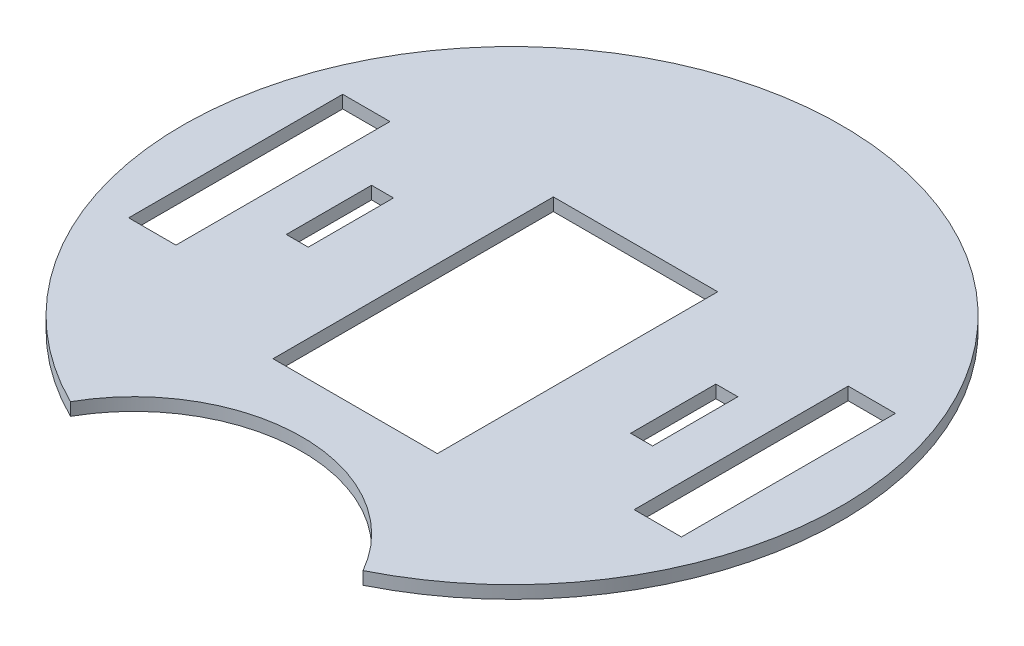
ISO-10303-21;
HEADER;
FILE_DESCRIPTION(('STEP AP214'),'2;1');
FILE_NAME('part.step','',(''),(''),'','','');
FILE_SCHEMA(('AUTOMOTIVE_DESIGN { 1 0 10303 214 1 1 1 1 }'));
ENDSEC;
DATA;
#1=APPLICATION_CONTEXT('core data for automotive mechanical design processes');
#2=APPLICATION_PROTOCOL_DEFINITION('international standard','automotive_design',2000,#1);
#3=PRODUCT_CONTEXT('',#1,'mechanical');
#4=PRODUCT('Part','Part','',(#3));
#5=PRODUCT_RELATED_PRODUCT_CATEGORY('part','',(#4));
#6=PRODUCT_DEFINITION_FORMATION('','',#4);
#7=PRODUCT_DEFINITION_CONTEXT('part definition',#1,'design');
#8=PRODUCT_DEFINITION('design','',#6,#7);
#9=PRODUCT_DEFINITION_SHAPE('','',#8);
#10=(LENGTH_UNIT() NAMED_UNIT(*) SI_UNIT(.MILLI.,.METRE.));
#11=(NAMED_UNIT(*) PLANE_ANGLE_UNIT() SI_UNIT($,.RADIAN.));
#12=(NAMED_UNIT(*) SI_UNIT($,.STERADIAN.) SOLID_ANGLE_UNIT());
#13=UNCERTAINTY_MEASURE_WITH_UNIT(LENGTH_MEASURE(1.E-05),#10,'distance_accuracy_value','');
#14=(GEOMETRIC_REPRESENTATION_CONTEXT(3) GLOBAL_UNCERTAINTY_ASSIGNED_CONTEXT((#13)) GLOBAL_UNIT_ASSIGNED_CONTEXT((#10,
#11,#12)) REPRESENTATION_CONTEXT('',''));
#15=CARTESIAN_POINT('',(0.,0.,0.));
#16=DIRECTION('',(0.,0.,1.));
#17=DIRECTION('',(1.,0.,0.));
#18=AXIS2_PLACEMENT_3D('',#15,#16,#17);
#19=CARTESIAN_POINT('',(0.,2.9,86.0416168146049));
#20=DIRECTION('',(0.,-1.,0.));
#21=DIRECTION('',(0.,0.,-1.));
#22=AXIS2_PLACEMENT_3D('',#19,#20,#21);
#23=CYLINDRICAL_SURFACE('',#22,38.25);
#24=CARTESIAN_POINT('',(0.,0.,86.0416168146049));
#25=DIRECTION('',(0.,-1.,0.));
#26=DIRECTION('',(0.,0.,1.));
#27=AXIS2_PLACEMENT_3D('',#24,#25,#26);
#28=CIRCLE('',#27,38.25);
#29=CARTESIAN_POINT('',(-33.2911053697012,0.,67.2064156406474));
#30=VERTEX_POINT('',#29);
#31=CARTESIAN_POINT('',(33.2911053697012,0.,67.2064156406474));
#32=VERTEX_POINT('',#31);
#33=EDGE_CURVE('E339',#30,#32,#28,.T.);
#34=ORIENTED_EDGE('',*,*,#33,.T.);
#35=DIRECTION('',(0.,-1.,0.));
#36=VECTOR('',#35,1.);
#37=CARTESIAN_POINT('',(33.2911053697012,2.9,67.2064156406474));
#38=LINE('',#37,#36);
#39=CARTESIAN_POINT('',(33.2911053697012,2.9,67.2064156406474));
#40=VERTEX_POINT('',#39);
#41=EDGE_CURVE('E11',#40,#32,#38,.T.);
#42=ORIENTED_EDGE('',*,*,#41,.F.);
#43=CARTESIAN_POINT('',(0.,2.9,86.0416168146049));
#44=DIRECTION('',(0.,-1.,0.));
#45=DIRECTION('',(0.,0.,1.));
#46=AXIS2_PLACEMENT_3D('',#43,#44,#45);
#47=CIRCLE('',#46,38.25);
#48=CARTESIAN_POINT('',(-33.2911053697012,2.9,67.2064156406474));
#49=VERTEX_POINT('',#48);
#50=EDGE_CURVE('E346',#49,#40,#47,.T.);
#51=ORIENTED_EDGE('',*,*,#50,.F.);
#52=DIRECTION('',(0.,-1.,0.));
#53=VECTOR('',#52,1.);
#54=CARTESIAN_POINT('',(-33.2911053697012,2.9,67.2064156406474));
#55=LINE('',#54,#53);
#56=EDGE_CURVE('E40',#49,#30,#55,.T.);
#57=ORIENTED_EDGE('',*,*,#56,.T.);
#58=EDGE_LOOP('',(#34,#42,#51,#57));
#59=FACE_BOUND('',#58,.T.);
#60=ADVANCED_FACE('F33',(#59),#23,.F.);
#61=CARTESIAN_POINT('',(0.,2.9,0.));
#62=DIRECTION('',(0.,-1.,0.));
#63=DIRECTION('',(0.,0.,-1.));
#64=AXIS2_PLACEMENT_3D('',#61,#62,#63);
#65=CYLINDRICAL_SURFACE('',#64,75.);
#66=CARTESIAN_POINT('',(0.,0.,0.));
#67=DIRECTION('',(0.,1.,0.));
#68=DIRECTION('',(0.,0.,1.));
#69=AXIS2_PLACEMENT_3D('',#66,#67,#68);
#70=CIRCLE('',#69,75.);
#71=EDGE_CURVE('E350',#32,#30,#70,.T.);
#72=ORIENTED_EDGE('',*,*,#71,.T.);
#73=ORIENTED_EDGE('',*,*,#56,.F.);
#74=CARTESIAN_POINT('',(0.,2.9,0.));
#75=DIRECTION('',(0.,1.,0.));
#76=DIRECTION('',(0.,0.,1.));
#77=AXIS2_PLACEMENT_3D('',#74,#75,#76);
#78=CIRCLE('',#77,75.);
#79=EDGE_CURVE('E349',#40,#49,#78,.T.);
#80=ORIENTED_EDGE('',*,*,#79,.F.);
#81=ORIENTED_EDGE('',*,*,#41,.T.);
#82=EDGE_LOOP('',(#72,#73,#80,#81));
#83=FACE_BOUND('',#82,.T.);
#84=ADVANCED_FACE('F362',(#83),#65,.T.);
#85=CARTESIAN_POINT('',(0.,2.9,43.0208084073025));
#86=DIRECTION('',(0.,1.,0.));
#87=DIRECTION('',(0.,0.,1.));
#88=AXIS2_PLACEMENT_3D('',#85,#86,#87);
#89=PLANE('',#88);
#90=DIRECTION('',(1.,0.,0.));
#91=VECTOR('',#90,1.);
#92=CARTESIAN_POINT('',(36.6798528025296,2.9,9.7));
#93=LINE('',#92,#91);
#94=CARTESIAN_POINT('',(36.6798528025296,2.9,9.7));
#95=VERTEX_POINT('',#94);
#96=CARTESIAN_POINT('',(41.6798528025296,2.9,9.7));
#97=VERTEX_POINT('',#96);
#98=EDGE_CURVE('E47',#95,#97,#93,.T.);
#99=ORIENTED_EDGE('',*,*,#98,.F.);
#100=DIRECTION('',(0.,0.,1.));
#101=VECTOR('',#100,1.);
#102=CARTESIAN_POINT('',(36.6798528025296,2.9,-9.7));
#103=LINE('',#102,#101);
#104=CARTESIAN_POINT('',(36.6798528025296,2.9,-9.7));
#105=VERTEX_POINT('',#104);
#106=EDGE_CURVE('E199',#105,#95,#103,.T.);
#107=ORIENTED_EDGE('',*,*,#106,.F.);
#108=DIRECTION('',(-1.,0.,0.));
#109=VECTOR('',#108,1.);
#110=CARTESIAN_POINT('',(41.6798528025296,2.9,-9.7));
#111=LINE('',#110,#109);
#112=CARTESIAN_POINT('',(41.6798528025296,2.9,-9.7));
#113=VERTEX_POINT('',#112);
#114=EDGE_CURVE('E202',#113,#105,#111,.T.);
#115=ORIENTED_EDGE('',*,*,#114,.F.);
#116=DIRECTION('',(0.,0.,-1.));
#117=VECTOR('',#116,1.);
#118=CARTESIAN_POINT('',(41.6798528025296,2.9,9.7));
#119=LINE('',#118,#117);
#120=EDGE_CURVE('E208',#97,#113,#119,.T.);
#121=ORIENTED_EDGE('',*,*,#120,.F.);
#122=EDGE_LOOP('',(#99,#107,#115,#121));
#123=FACE_BOUND('',#122,.T.);
#124=DIRECTION('',(0.,0.,1.));
#125=VECTOR('',#124,1.);
#126=CARTESIAN_POINT('',(-41.6798528025296,2.9,-9.7));
#127=LINE('',#126,#125);
#128=CARTESIAN_POINT('',(-41.6798528025296,2.9,-9.7));
#129=VERTEX_POINT('',#128);
#130=CARTESIAN_POINT('',(-41.6798528025296,2.9,9.7));
#131=VERTEX_POINT('',#130);
#132=EDGE_CURVE('E214',#129,#131,#127,.T.);
#133=ORIENTED_EDGE('',*,*,#132,.F.);
#134=DIRECTION('',(-1.,0.,0.));
#135=VECTOR('',#134,1.);
#136=CARTESIAN_POINT('',(-36.6798528025296,2.9,-9.7));
#137=LINE('',#136,#135);
#138=CARTESIAN_POINT('',(-36.6798528025296,2.9,-9.7));
#139=VERTEX_POINT('',#138);
#140=EDGE_CURVE('E222',#139,#129,#137,.T.);
#141=ORIENTED_EDGE('',*,*,#140,.F.);
#142=DIRECTION('',(0.,0.,-1.));
#143=VECTOR('',#142,1.);
#144=CARTESIAN_POINT('',(-36.6798528025296,2.9,9.7));
#145=LINE('',#144,#143);
#146=CARTESIAN_POINT('',(-36.6798528025296,2.9,9.7));
#147=VERTEX_POINT('',#146);
#148=EDGE_CURVE('E236',#147,#139,#145,.T.);
#149=ORIENTED_EDGE('',*,*,#148,.F.);
#150=DIRECTION('',(1.,0.,0.));
#151=VECTOR('',#150,1.);
#152=CARTESIAN_POINT('',(-41.6798528025296,2.9,9.7));
#153=LINE('',#152,#151);
#154=EDGE_CURVE('E233',#131,#147,#153,.T.);
#155=ORIENTED_EDGE('',*,*,#154,.F.);
#156=EDGE_LOOP('',(#133,#141,#149,#155));
#157=FACE_BOUND('',#156,.T.);
#158=DIRECTION('',(0.,0.,1.));
#159=VECTOR('',#158,1.);
#160=CARTESIAN_POINT('',(52.1374919880577,2.9,24.3527837526134));
#161=LINE('',#160,#159);
#162=CARTESIAN_POINT('',(52.1374919880577,2.9,-24.3527837526135));
#163=VERTEX_POINT('',#162);
#164=CARTESIAN_POINT('',(52.1374919880577,2.9,24.3527837526134));
#165=VERTEX_POINT('',#164);
#166=EDGE_CURVE('E243',#163,#165,#161,.T.);
#167=ORIENTED_EDGE('',*,*,#166,.F.);
#168=DIRECTION('',(-1.,0.,0.));
#169=VECTOR('',#168,1.);
#170=CARTESIAN_POINT('',(62.8974919880577,2.9,-24.3527837526135));
#171=LINE('',#170,#169);
#172=CARTESIAN_POINT('',(62.8974919880577,2.9,-24.3527837526135));
#173=VERTEX_POINT('',#172);
#174=EDGE_CURVE('E254',#173,#163,#171,.T.);
#175=ORIENTED_EDGE('',*,*,#174,.F.);
#176=DIRECTION('',(0.,0.,-1.));
#177=VECTOR('',#176,1.);
#178=CARTESIAN_POINT('',(62.8974919880577,2.9,24.3527837526134));
#179=LINE('',#178,#177);
#180=CARTESIAN_POINT('',(62.8974919880577,2.9,24.3527837526134));
#181=VERTEX_POINT('',#180);
#182=EDGE_CURVE('E268',#181,#173,#179,.T.);
#183=ORIENTED_EDGE('',*,*,#182,.F.);
#184=DIRECTION('',(1.,0.,0.));
#185=VECTOR('',#184,1.);
#186=CARTESIAN_POINT('',(62.8974919880577,2.9,24.3527837526134));
#187=LINE('',#186,#185);
#188=EDGE_CURVE('E265',#165,#181,#187,.T.);
#189=ORIENTED_EDGE('',*,*,#188,.F.);
#190=EDGE_LOOP('',(#167,#175,#183,#189));
#191=FACE_BOUND('',#190,.T.);
#192=DIRECTION('',(0.,0.,1.));
#193=VECTOR('',#192,1.);
#194=CARTESIAN_POINT('',(-62.8974919880577,2.9,24.3527837526134));
#195=LINE('',#194,#193);
#196=CARTESIAN_POINT('',(-62.8974919880577,2.9,-24.3527837526135));
#197=VERTEX_POINT('',#196);
#198=CARTESIAN_POINT('',(-62.8974919880577,2.9,24.3527837526134));
#199=VERTEX_POINT('',#198);
#200=EDGE_CURVE('E275',#197,#199,#195,.T.);
#201=ORIENTED_EDGE('',*,*,#200,.F.);
#202=DIRECTION('',(-1.,0.,0.));
#203=VECTOR('',#202,1.);
#204=CARTESIAN_POINT('',(-62.8974919880577,2.9,-24.3527837526135));
#205=LINE('',#204,#203);
#206=CARTESIAN_POINT('',(-52.1374919880577,2.9,-24.3527837526135));
#207=VERTEX_POINT('',#206);
#208=EDGE_CURVE('E286',#207,#197,#205,.T.);
#209=ORIENTED_EDGE('',*,*,#208,.F.);
#210=DIRECTION('',(0.,0.,-1.));
#211=VECTOR('',#210,1.);
#212=CARTESIAN_POINT('',(-52.1374919880577,2.9,24.3527837526134));
#213=LINE('',#212,#211);
#214=CARTESIAN_POINT('',(-52.1374919880577,2.9,24.3527837526134));
#215=VERTEX_POINT('',#214);
#216=EDGE_CURVE('E300',#215,#207,#213,.T.);
#217=ORIENTED_EDGE('',*,*,#216,.F.);
#218=DIRECTION('',(1.,0.,0.));
#219=VECTOR('',#218,1.);
#220=CARTESIAN_POINT('',(-62.8974919880577,2.9,24.3527837526134));
#221=LINE('',#220,#219);
#222=EDGE_CURVE('E297',#199,#215,#221,.T.);
#223=ORIENTED_EDGE('',*,*,#222,.F.);
#224=EDGE_LOOP('',(#201,#209,#217,#223));
#225=FACE_BOUND('',#224,.T.);
#226=DIRECTION('',(0.,0.,1.));
#227=VECTOR('',#226,1.);
#228=CARTESIAN_POINT('',(-18.7,2.9,35.7));
#229=LINE('',#228,#227);
#230=CARTESIAN_POINT('',(-18.7,2.9,-28.1));
#231=VERTEX_POINT('',#230);
#232=CARTESIAN_POINT('',(-18.7,2.9,35.7));
#233=VERTEX_POINT('',#232);
#234=EDGE_CURVE('E307',#231,#233,#229,.T.);
#235=ORIENTED_EDGE('',*,*,#234,.F.);
#236=DIRECTION('',(-1.,0.,0.));
#237=VECTOR('',#236,1.);
#238=CARTESIAN_POINT('',(-18.7,2.9,-28.1));
#239=LINE('',#238,#237);
#240=CARTESIAN_POINT('',(18.7,2.9,-28.1));
#241=VERTEX_POINT('',#240);
#242=EDGE_CURVE('E318',#241,#231,#239,.T.);
#243=ORIENTED_EDGE('',*,*,#242,.F.);
#244=DIRECTION('',(0.,0.,-1.));
#245=VECTOR('',#244,1.);
#246=CARTESIAN_POINT('',(18.7,2.9,35.7));
#247=LINE('',#246,#245);
#248=CARTESIAN_POINT('',(18.7,2.9,35.7));
#249=VERTEX_POINT('',#248);
#250=EDGE_CURVE('E332',#249,#241,#247,.T.);
#251=ORIENTED_EDGE('',*,*,#250,.F.);
#252=DIRECTION('',(1.,0.,0.));
#253=VECTOR('',#252,1.);
#254=CARTESIAN_POINT('',(-18.7,2.9,35.7));
#255=LINE('',#254,#253);
#256=EDGE_CURVE('E329',#233,#249,#255,.T.);
#257=ORIENTED_EDGE('',*,*,#256,.F.);
#258=EDGE_LOOP('',(#235,#243,#251,#257));
#259=FACE_BOUND('',#258,.T.);
#260=ORIENTED_EDGE('',*,*,#50,.T.);
#261=ORIENTED_EDGE('',*,*,#79,.T.);
#262=EDGE_LOOP('',(#260,#261));
#263=FACE_BOUND('',#262,.T.);
#264=ADVANCED_FACE('F364',(#123,#157,#191,#225,#259,#263),#89,.T.);
#265=CARTESIAN_POINT('',(0.,0.,43.0208084073025));
#266=DIRECTION('',(0.,1.,0.));
#267=DIRECTION('',(0.,0.,1.));
#268=AXIS2_PLACEMENT_3D('',#265,#266,#267);
#269=PLANE('',#268);
#270=DIRECTION('',(0.,0.,1.));
#271=VECTOR('',#270,1.);
#272=CARTESIAN_POINT('',(36.6798528025296,0.,-9.7));
#273=LINE('',#272,#271);
#274=CARTESIAN_POINT('',(36.6798528025296,0.,-9.7));
#275=VERTEX_POINT('',#274);
#276=CARTESIAN_POINT('',(36.6798528025296,0.,9.7));
#277=VERTEX_POINT('',#276);
#278=EDGE_CURVE('E189',#275,#277,#273,.T.);
#279=ORIENTED_EDGE('',*,*,#278,.T.);
#280=DIRECTION('',(1.,0.,0.));
#281=VECTOR('',#280,1.);
#282=CARTESIAN_POINT('',(36.6798528025296,0.,9.7));
#283=LINE('',#282,#281);
#284=CARTESIAN_POINT('',(41.6798528025296,0.,9.7));
#285=VERTEX_POINT('',#284);
#286=EDGE_CURVE('E183',#277,#285,#283,.T.);
#287=ORIENTED_EDGE('',*,*,#286,.T.);
#288=DIRECTION('',(0.,0.,-1.));
#289=VECTOR('',#288,1.);
#290=CARTESIAN_POINT('',(41.6798528025296,0.,9.7));
#291=LINE('',#290,#289);
#292=CARTESIAN_POINT('',(41.6798528025296,0.,-9.69999999999999));
#293=VERTEX_POINT('',#292);
#294=EDGE_CURVE('E192',#285,#293,#291,.T.);
#295=ORIENTED_EDGE('',*,*,#294,.T.);
#296=DIRECTION('',(-1.,0.,0.));
#297=VECTOR('',#296,1.);
#298=CARTESIAN_POINT('',(41.6798528025296,0.,-9.7));
#299=LINE('',#298,#297);
#300=EDGE_CURVE('E55',#293,#275,#299,.T.);
#301=ORIENTED_EDGE('',*,*,#300,.T.);
#302=EDGE_LOOP('',(#279,#287,#295,#301));
#303=FACE_BOUND('',#302,.T.);
#304=DIRECTION('',(-1.,0.,0.));
#305=VECTOR('',#304,1.);
#306=CARTESIAN_POINT('',(-36.6798528025296,0.,-9.7));
#307=LINE('',#306,#305);
#308=CARTESIAN_POINT('',(-36.6798528025296,0.,-9.7));
#309=VERTEX_POINT('',#308);
#310=CARTESIAN_POINT('',(-41.6798528025296,0.,-9.7));
#311=VERTEX_POINT('',#310);
#312=EDGE_CURVE('E228',#309,#311,#307,.T.);
#313=ORIENTED_EDGE('',*,*,#312,.T.);
#314=DIRECTION('',(0.,0.,1.));
#315=VECTOR('',#314,1.);
#316=CARTESIAN_POINT('',(-41.6798528025296,0.,-9.7));
#317=LINE('',#316,#315);
#318=CARTESIAN_POINT('',(-41.6798528025296,0.,9.7));
#319=VERTEX_POINT('',#318);
#320=EDGE_CURVE('E218',#311,#319,#317,.T.);
#321=ORIENTED_EDGE('',*,*,#320,.T.);
#322=DIRECTION('',(1.,0.,0.));
#323=VECTOR('',#322,1.);
#324=CARTESIAN_POINT('',(-41.6798528025296,0.,9.7));
#325=LINE('',#324,#323);
#326=CARTESIAN_POINT('',(-36.6798528025296,0.,9.7));
#327=VERTEX_POINT('',#326);
#328=EDGE_CURVE('E221',#319,#327,#325,.T.);
#329=ORIENTED_EDGE('',*,*,#328,.T.);
#330=DIRECTION('',(0.,0.,-1.));
#331=VECTOR('',#330,1.);
#332=CARTESIAN_POINT('',(-36.6798528025296,0.,9.7));
#333=LINE('',#332,#331);
#334=EDGE_CURVE('E225',#327,#309,#333,.T.);
#335=ORIENTED_EDGE('',*,*,#334,.T.);
#336=EDGE_LOOP('',(#313,#321,#329,#335));
#337=FACE_BOUND('',#336,.T.);
#338=DIRECTION('',(-1.,0.,0.));
#339=VECTOR('',#338,1.);
#340=CARTESIAN_POINT('',(62.8974919880577,0.,-24.3527837526135));
#341=LINE('',#340,#339);
#342=CARTESIAN_POINT('',(62.8974919880577,0.,-24.3527837526135));
#343=VERTEX_POINT('',#342);
#344=CARTESIAN_POINT('',(52.1374919880577,0.,-24.3527837526135));
#345=VERTEX_POINT('',#344);
#346=EDGE_CURVE('E260',#343,#345,#341,.T.);
#347=ORIENTED_EDGE('',*,*,#346,.T.);
#348=DIRECTION('',(0.,0.,1.));
#349=VECTOR('',#348,1.);
#350=CARTESIAN_POINT('',(52.1374919880577,0.,24.3527837526134));
#351=LINE('',#350,#349);
#352=CARTESIAN_POINT('',(52.1374919880577,0.,24.3527837526134));
#353=VERTEX_POINT('',#352);
#354=EDGE_CURVE('E250',#345,#353,#351,.T.);
#355=ORIENTED_EDGE('',*,*,#354,.T.);
#356=DIRECTION('',(1.,0.,0.));
#357=VECTOR('',#356,1.);
#358=CARTESIAN_POINT('',(62.8974919880577,0.,24.3527837526134));
#359=LINE('',#358,#357);
#360=CARTESIAN_POINT('',(62.8974919880577,0.,24.3527837526134));
#361=VERTEX_POINT('',#360);
#362=EDGE_CURVE('E253',#353,#361,#359,.T.);
#363=ORIENTED_EDGE('',*,*,#362,.T.);
#364=DIRECTION('',(0.,0.,-1.));
#365=VECTOR('',#364,1.);
#366=CARTESIAN_POINT('',(62.8974919880577,0.,24.3527837526134));
#367=LINE('',#366,#365);
#368=EDGE_CURVE('E257',#361,#343,#367,.T.);
#369=ORIENTED_EDGE('',*,*,#368,.T.);
#370=EDGE_LOOP('',(#347,#355,#363,#369));
#371=FACE_BOUND('',#370,.T.);
#372=DIRECTION('',(-1.,0.,0.));
#373=VECTOR('',#372,1.);
#374=CARTESIAN_POINT('',(-62.8974919880577,0.,-24.3527837526135));
#375=LINE('',#374,#373);
#376=CARTESIAN_POINT('',(-52.1374919880577,0.,-24.3527837526135));
#377=VERTEX_POINT('',#376);
#378=CARTESIAN_POINT('',(-62.8974919880577,0.,-24.3527837526135));
#379=VERTEX_POINT('',#378);
#380=EDGE_CURVE('E292',#377,#379,#375,.T.);
#381=ORIENTED_EDGE('',*,*,#380,.T.);
#382=DIRECTION('',(0.,0.,1.));
#383=VECTOR('',#382,1.);
#384=CARTESIAN_POINT('',(-62.8974919880577,0.,24.3527837526134));
#385=LINE('',#384,#383);
#386=CARTESIAN_POINT('',(-62.8974919880577,0.,24.3527837526134));
#387=VERTEX_POINT('',#386);
#388=EDGE_CURVE('E282',#379,#387,#385,.T.);
#389=ORIENTED_EDGE('',*,*,#388,.T.);
#390=DIRECTION('',(1.,0.,0.));
#391=VECTOR('',#390,1.);
#392=CARTESIAN_POINT('',(-62.8974919880577,0.,24.3527837526134));
#393=LINE('',#392,#391);
#394=CARTESIAN_POINT('',(-52.1374919880577,0.,24.3527837526134));
#395=VERTEX_POINT('',#394);
#396=EDGE_CURVE('E285',#387,#395,#393,.T.);
#397=ORIENTED_EDGE('',*,*,#396,.T.);
#398=DIRECTION('',(0.,0.,-1.));
#399=VECTOR('',#398,1.);
#400=CARTESIAN_POINT('',(-52.1374919880577,0.,24.3527837526134));
#401=LINE('',#400,#399);
#402=EDGE_CURVE('E289',#395,#377,#401,.T.);
#403=ORIENTED_EDGE('',*,*,#402,.T.);
#404=EDGE_LOOP('',(#381,#389,#397,#403));
#405=FACE_BOUND('',#404,.T.);
#406=DIRECTION('',(-1.,0.,0.));
#407=VECTOR('',#406,1.);
#408=CARTESIAN_POINT('',(-18.7,0.,-28.1));
#409=LINE('',#408,#407);
#410=CARTESIAN_POINT('',(18.7,0.,-28.1));
#411=VERTEX_POINT('',#410);
#412=CARTESIAN_POINT('',(-18.7,0.,-28.1));
#413=VERTEX_POINT('',#412);
#414=EDGE_CURVE('E324',#411,#413,#409,.T.);
#415=ORIENTED_EDGE('',*,*,#414,.T.);
#416=DIRECTION('',(0.,0.,1.));
#417=VECTOR('',#416,1.);
#418=CARTESIAN_POINT('',(-18.7,0.,35.7));
#419=LINE('',#418,#417);
#420=CARTESIAN_POINT('',(-18.7,0.,35.7));
#421=VERTEX_POINT('',#420);
#422=EDGE_CURVE('E314',#413,#421,#419,.T.);
#423=ORIENTED_EDGE('',*,*,#422,.T.);
#424=DIRECTION('',(1.,0.,0.));
#425=VECTOR('',#424,1.);
#426=CARTESIAN_POINT('',(-18.7,0.,35.7));
#427=LINE('',#426,#425);
#428=CARTESIAN_POINT('',(18.7,0.,35.7));
#429=VERTEX_POINT('',#428);
#430=EDGE_CURVE('E317',#421,#429,#427,.T.);
#431=ORIENTED_EDGE('',*,*,#430,.T.);
#432=DIRECTION('',(0.,0.,-1.));
#433=VECTOR('',#432,1.);
#434=CARTESIAN_POINT('',(18.7,0.,35.7));
#435=LINE('',#434,#433);
#436=EDGE_CURVE('E321',#429,#411,#435,.T.);
#437=ORIENTED_EDGE('',*,*,#436,.T.);
#438=EDGE_LOOP('',(#415,#423,#431,#437));
#439=FACE_BOUND('',#438,.T.);
#440=ORIENTED_EDGE('',*,*,#33,.F.);
#441=ORIENTED_EDGE('',*,*,#71,.F.);
#442=EDGE_LOOP('',(#440,#441));
#443=FACE_BOUND('',#442,.T.);
#444=ADVANCED_FACE('F196',(#303,#337,#371,#405,#439,#443),#269,.F.);
#445=CARTESIAN_POINT('',(-18.7,0.,35.7));
#446=DIRECTION('',(-1.,0.,0.));
#447=DIRECTION('',(0.,0.,1.));
#448=AXIS2_PLACEMENT_3D('',#445,#446,#447);
#449=PLANE('',#448);
#450=ORIENTED_EDGE('',*,*,#234,.T.);
#451=DIRECTION('',(0.,1.,0.));
#452=VECTOR('',#451,1.);
#453=CARTESIAN_POINT('',(-18.7,0.,35.7));
#454=LINE('',#453,#452);
#455=EDGE_CURVE('E327',#421,#233,#454,.T.);
#456=ORIENTED_EDGE('',*,*,#455,.F.);
#457=ORIENTED_EDGE('',*,*,#422,.F.);
#458=DIRECTION('',(0.,1.,0.));
#459=VECTOR('',#458,1.);
#460=CARTESIAN_POINT('',(-18.7,0.,-28.1));
#461=LINE('',#460,#459);
#462=EDGE_CURVE('E337',#413,#231,#461,.T.);
#463=ORIENTED_EDGE('',*,*,#462,.T.);
#464=EDGE_LOOP('',(#450,#456,#457,#463));
#465=FACE_BOUND('',#464,.T.);
#466=ADVANCED_FACE('F372',(#465),#449,.F.);
#467=CARTESIAN_POINT('',(-18.7,0.,-28.1));
#468=DIRECTION('',(0.,0.,-1.));
#469=DIRECTION('',(-1.,0.,0.));
#470=AXIS2_PLACEMENT_3D('',#467,#468,#469);
#471=PLANE('',#470);
#472=ORIENTED_EDGE('',*,*,#242,.T.);
#473=ORIENTED_EDGE('',*,*,#462,.F.);
#474=ORIENTED_EDGE('',*,*,#414,.F.);
#475=DIRECTION('',(0.,1.,0.));
#476=VECTOR('',#475,1.);
#477=CARTESIAN_POINT('',(18.7,0.,-28.1));
#478=LINE('',#477,#476);
#479=EDGE_CURVE('E340',#411,#241,#478,.T.);
#480=ORIENTED_EDGE('',*,*,#479,.T.);
#481=EDGE_LOOP('',(#472,#473,#474,#480));
#482=FACE_BOUND('',#481,.T.);
#483=ADVANCED_FACE('F393',(#482),#471,.F.);
#484=CARTESIAN_POINT('',(18.7,0.,35.7));
#485=DIRECTION('',(1.,0.,0.));
#486=DIRECTION('',(0.,0.,-1.));
#487=AXIS2_PLACEMENT_3D('',#484,#485,#486);
#488=PLANE('',#487);
#489=ORIENTED_EDGE('',*,*,#250,.T.);
#490=ORIENTED_EDGE('',*,*,#479,.F.);
#491=ORIENTED_EDGE('',*,*,#436,.F.);
#492=DIRECTION('',(0.,1.,0.));
#493=VECTOR('',#492,1.);
#494=CARTESIAN_POINT('',(18.7,0.,35.7));
#495=LINE('',#494,#493);
#496=EDGE_CURVE('E342',#429,#249,#495,.T.);
#497=ORIENTED_EDGE('',*,*,#496,.T.);
#498=EDGE_LOOP('',(#489,#490,#491,#497));
#499=FACE_BOUND('',#498,.T.);
#500=ADVANCED_FACE('F403',(#499),#488,.F.);
#501=CARTESIAN_POINT('',(-18.7,0.,35.7));
#502=DIRECTION('',(0.,0.,1.));
#503=DIRECTION('',(1.,0.,0.));
#504=AXIS2_PLACEMENT_3D('',#501,#502,#503);
#505=PLANE('',#504);
#506=ORIENTED_EDGE('',*,*,#256,.T.);
#507=ORIENTED_EDGE('',*,*,#496,.F.);
#508=ORIENTED_EDGE('',*,*,#430,.F.);
#509=ORIENTED_EDGE('',*,*,#455,.T.);
#510=EDGE_LOOP('',(#506,#507,#508,#509));
#511=FACE_BOUND('',#510,.T.);
#512=ADVANCED_FACE('F413',(#511),#505,.F.);
#513=CARTESIAN_POINT('',(-62.8974919880577,0.,24.3527837526134));
#514=DIRECTION('',(-1.,0.,0.));
#515=DIRECTION('',(0.,0.,1.));
#516=AXIS2_PLACEMENT_3D('',#513,#514,#515);
#517=PLANE('',#516);
#518=ORIENTED_EDGE('',*,*,#200,.T.);
#519=DIRECTION('',(0.,1.,0.));
#520=VECTOR('',#519,1.);
#521=CARTESIAN_POINT('',(-62.8974919880577,0.,24.3527837526134));
#522=LINE('',#521,#520);
#523=EDGE_CURVE('E295',#387,#199,#522,.T.);
#524=ORIENTED_EDGE('',*,*,#523,.F.);
#525=ORIENTED_EDGE('',*,*,#388,.F.);
#526=DIRECTION('',(0.,1.,0.));
#527=VECTOR('',#526,1.);
#528=CARTESIAN_POINT('',(-62.8974919880577,0.,-24.3527837526135));
#529=LINE('',#528,#527);
#530=EDGE_CURVE('E305',#379,#197,#529,.T.);
#531=ORIENTED_EDGE('',*,*,#530,.T.);
#532=EDGE_LOOP('',(#518,#524,#525,#531));
#533=FACE_BOUND('',#532,.T.);
#534=ADVANCED_FACE('F423',(#533),#517,.F.);
#535=CARTESIAN_POINT('',(-62.8974919880577,0.,-24.3527837526135));
#536=DIRECTION('',(0.,0.,-1.));
#537=DIRECTION('',(-1.,0.,0.));
#538=AXIS2_PLACEMENT_3D('',#535,#536,#537);
#539=PLANE('',#538);
#540=ORIENTED_EDGE('',*,*,#208,.T.);
#541=ORIENTED_EDGE('',*,*,#530,.F.);
#542=ORIENTED_EDGE('',*,*,#380,.F.);
#543=DIRECTION('',(0.,1.,0.));
#544=VECTOR('',#543,1.);
#545=CARTESIAN_POINT('',(-52.1374919880577,0.,-24.3527837526135));
#546=LINE('',#545,#544);
#547=EDGE_CURVE('E308',#377,#207,#546,.T.);
#548=ORIENTED_EDGE('',*,*,#547,.T.);
#549=EDGE_LOOP('',(#540,#541,#542,#548));
#550=FACE_BOUND('',#549,.T.);
#551=ADVANCED_FACE('F433',(#550),#539,.F.);
#552=CARTESIAN_POINT('',(-52.1374919880577,0.,24.3527837526134));
#553=DIRECTION('',(1.,0.,0.));
#554=DIRECTION('',(0.,0.,-1.));
#555=AXIS2_PLACEMENT_3D('',#552,#553,#554);
#556=PLANE('',#555);
#557=ORIENTED_EDGE('',*,*,#216,.T.);
#558=ORIENTED_EDGE('',*,*,#547,.F.);
#559=ORIENTED_EDGE('',*,*,#402,.F.);
#560=DIRECTION('',(0.,1.,0.));
#561=VECTOR('',#560,1.);
#562=CARTESIAN_POINT('',(-52.1374919880577,0.,24.3527837526134));
#563=LINE('',#562,#561);
#564=EDGE_CURVE('E310',#395,#215,#563,.T.);
#565=ORIENTED_EDGE('',*,*,#564,.T.);
#566=EDGE_LOOP('',(#557,#558,#559,#565));
#567=FACE_BOUND('',#566,.T.);
#568=ADVANCED_FACE('F443',(#567),#556,.F.);
#569=CARTESIAN_POINT('',(-62.8974919880577,0.,24.3527837526134));
#570=DIRECTION('',(0.,0.,1.));
#571=DIRECTION('',(1.,0.,0.));
#572=AXIS2_PLACEMENT_3D('',#569,#570,#571);
#573=PLANE('',#572);
#574=ORIENTED_EDGE('',*,*,#222,.T.);
#575=ORIENTED_EDGE('',*,*,#564,.F.);
#576=ORIENTED_EDGE('',*,*,#396,.F.);
#577=ORIENTED_EDGE('',*,*,#523,.T.);
#578=EDGE_LOOP('',(#574,#575,#576,#577));
#579=FACE_BOUND('',#578,.T.);
#580=ADVANCED_FACE('F453',(#579),#573,.F.);
#581=CARTESIAN_POINT('',(52.1374919880577,0.,24.3527837526134));
#582=DIRECTION('',(-1.,0.,0.));
#583=DIRECTION('',(0.,0.,1.));
#584=AXIS2_PLACEMENT_3D('',#581,#582,#583);
#585=PLANE('',#584);
#586=ORIENTED_EDGE('',*,*,#166,.T.);
#587=DIRECTION('',(0.,1.,0.));
#588=VECTOR('',#587,1.);
#589=CARTESIAN_POINT('',(52.1374919880577,0.,24.3527837526134));
#590=LINE('',#589,#588);
#591=EDGE_CURVE('E263',#353,#165,#590,.T.);
#592=ORIENTED_EDGE('',*,*,#591,.F.);
#593=ORIENTED_EDGE('',*,*,#354,.F.);
#594=DIRECTION('',(0.,1.,0.));
#595=VECTOR('',#594,1.);
#596=CARTESIAN_POINT('',(52.1374919880577,0.,-24.3527837526135));
#597=LINE('',#596,#595);
#598=EDGE_CURVE('E273',#345,#163,#597,.T.);
#599=ORIENTED_EDGE('',*,*,#598,.T.);
#600=EDGE_LOOP('',(#586,#592,#593,#599));
#601=FACE_BOUND('',#600,.T.);
#602=ADVANCED_FACE('F463',(#601),#585,.F.);
#603=CARTESIAN_POINT('',(62.8974919880577,0.,-24.3527837526135));
#604=DIRECTION('',(0.,0.,-1.));
#605=DIRECTION('',(-1.,0.,0.));
#606=AXIS2_PLACEMENT_3D('',#603,#604,#605);
#607=PLANE('',#606);
#608=ORIENTED_EDGE('',*,*,#174,.T.);
#609=ORIENTED_EDGE('',*,*,#598,.F.);
#610=ORIENTED_EDGE('',*,*,#346,.F.);
#611=DIRECTION('',(0.,1.,0.));
#612=VECTOR('',#611,1.);
#613=CARTESIAN_POINT('',(62.8974919880577,0.,-24.3527837526135));
#614=LINE('',#613,#612);
#615=EDGE_CURVE('E276',#343,#173,#614,.T.);
#616=ORIENTED_EDGE('',*,*,#615,.T.);
#617=EDGE_LOOP('',(#608,#609,#610,#616));
#618=FACE_BOUND('',#617,.T.);
#619=ADVANCED_FACE('F473',(#618),#607,.F.);
#620=CARTESIAN_POINT('',(62.8974919880577,0.,24.3527837526134));
#621=DIRECTION('',(1.,0.,0.));
#622=DIRECTION('',(0.,0.,-1.));
#623=AXIS2_PLACEMENT_3D('',#620,#621,#622);
#624=PLANE('',#623);
#625=ORIENTED_EDGE('',*,*,#182,.T.);
#626=ORIENTED_EDGE('',*,*,#615,.F.);
#627=ORIENTED_EDGE('',*,*,#368,.F.);
#628=DIRECTION('',(0.,1.,0.));
#629=VECTOR('',#628,1.);
#630=CARTESIAN_POINT('',(62.8974919880577,0.,24.3527837526134));
#631=LINE('',#630,#629);
#632=EDGE_CURVE('E278',#361,#181,#631,.T.);
#633=ORIENTED_EDGE('',*,*,#632,.T.);
#634=EDGE_LOOP('',(#625,#626,#627,#633));
#635=FACE_BOUND('',#634,.T.);
#636=ADVANCED_FACE('F483',(#635),#624,.F.);
#637=CARTESIAN_POINT('',(62.8974919880577,0.,24.3527837526134));
#638=DIRECTION('',(0.,0.,1.));
#639=DIRECTION('',(1.,0.,0.));
#640=AXIS2_PLACEMENT_3D('',#637,#638,#639);
#641=PLANE('',#640);
#642=ORIENTED_EDGE('',*,*,#188,.T.);
#643=ORIENTED_EDGE('',*,*,#632,.F.);
#644=ORIENTED_EDGE('',*,*,#362,.F.);
#645=ORIENTED_EDGE('',*,*,#591,.T.);
#646=EDGE_LOOP('',(#642,#643,#644,#645));
#647=FACE_BOUND('',#646,.T.);
#648=ADVANCED_FACE('F493',(#647),#641,.F.);
#649=CARTESIAN_POINT('',(-41.6798528025296,0.,-9.7));
#650=DIRECTION('',(-1.,0.,0.));
#651=DIRECTION('',(0.,0.,1.));
#652=AXIS2_PLACEMENT_3D('',#649,#650,#651);
#653=PLANE('',#652);
#654=ORIENTED_EDGE('',*,*,#132,.T.);
#655=DIRECTION('',(0.,1.,0.));
#656=VECTOR('',#655,1.);
#657=CARTESIAN_POINT('',(-41.6798528025296,0.,9.7));
#658=LINE('',#657,#656);
#659=EDGE_CURVE('E231',#319,#131,#658,.T.);
#660=ORIENTED_EDGE('',*,*,#659,.F.);
#661=ORIENTED_EDGE('',*,*,#320,.F.);
#662=DIRECTION('',(0.,1.,0.));
#663=VECTOR('',#662,1.);
#664=CARTESIAN_POINT('',(-41.6798528025296,0.,-9.7));
#665=LINE('',#664,#663);
#666=EDGE_CURVE('E241',#311,#129,#665,.T.);
#667=ORIENTED_EDGE('',*,*,#666,.T.);
#668=EDGE_LOOP('',(#654,#660,#661,#667));
#669=FACE_BOUND('',#668,.T.);
#670=ADVANCED_FACE('F502',(#669),#653,.F.);
#671=CARTESIAN_POINT('',(-36.6798528025296,0.,-9.7));
#672=DIRECTION('',(0.,0.,-1.));
#673=DIRECTION('',(-1.,0.,0.));
#674=AXIS2_PLACEMENT_3D('',#671,#672,#673);
#675=PLANE('',#674);
#676=ORIENTED_EDGE('',*,*,#140,.T.);
#677=ORIENTED_EDGE('',*,*,#666,.F.);
#678=ORIENTED_EDGE('',*,*,#312,.F.);
#679=DIRECTION('',(0.,1.,0.));
#680=VECTOR('',#679,1.);
#681=CARTESIAN_POINT('',(-36.6798528025296,0.,-9.7));
#682=LINE('',#681,#680);
#683=EDGE_CURVE('E244',#309,#139,#682,.T.);
#684=ORIENTED_EDGE('',*,*,#683,.T.);
#685=EDGE_LOOP('',(#676,#677,#678,#684));
#686=FACE_BOUND('',#685,.T.);
#687=ADVANCED_FACE('F521',(#686),#675,.F.);
#688=CARTESIAN_POINT('',(-36.6798528025296,0.,9.7));
#689=DIRECTION('',(1.,0.,0.));
#690=DIRECTION('',(0.,0.,-1.));
#691=AXIS2_PLACEMENT_3D('',#688,#689,#690);
#692=PLANE('',#691);
#693=ORIENTED_EDGE('',*,*,#148,.T.);
#694=ORIENTED_EDGE('',*,*,#683,.F.);
#695=ORIENTED_EDGE('',*,*,#334,.F.);
#696=DIRECTION('',(0.,1.,0.));
#697=VECTOR('',#696,1.);
#698=CARTESIAN_POINT('',(-36.6798528025296,0.,9.7));
#699=LINE('',#698,#697);
#700=EDGE_CURVE('E246',#327,#147,#699,.T.);
#701=ORIENTED_EDGE('',*,*,#700,.T.);
#702=EDGE_LOOP('',(#693,#694,#695,#701));
#703=FACE_BOUND('',#702,.T.);
#704=ADVANCED_FACE('F531',(#703),#692,.F.);
#705=CARTESIAN_POINT('',(-41.6798528025296,0.,9.7));
#706=DIRECTION('',(0.,0.,1.));
#707=DIRECTION('',(1.,0.,0.));
#708=AXIS2_PLACEMENT_3D('',#705,#706,#707);
#709=PLANE('',#708);
#710=ORIENTED_EDGE('',*,*,#154,.T.);
#711=ORIENTED_EDGE('',*,*,#700,.F.);
#712=ORIENTED_EDGE('',*,*,#328,.F.);
#713=ORIENTED_EDGE('',*,*,#659,.T.);
#714=EDGE_LOOP('',(#710,#711,#712,#713));
#715=FACE_BOUND('',#714,.T.);
#716=ADVANCED_FACE('F541',(#715),#709,.F.);
#717=CARTESIAN_POINT('',(36.6798528025296,0.,9.7));
#718=DIRECTION('',(0.,0.,1.));
#719=DIRECTION('',(1.,0.,0.));
#720=AXIS2_PLACEMENT_3D('',#717,#718,#719);
#721=PLANE('',#720);
#722=ORIENTED_EDGE('',*,*,#98,.T.);
#723=DIRECTION('',(0.,1.,0.));
#724=VECTOR('',#723,1.);
#725=CARTESIAN_POINT('',(41.6798528025296,0.,9.7));
#726=LINE('',#725,#724);
#727=EDGE_CURVE('E179',#285,#97,#726,.T.);
#728=ORIENTED_EDGE('',*,*,#727,.F.);
#729=ORIENTED_EDGE('',*,*,#286,.F.);
#730=DIRECTION('',(0.,1.,0.));
#731=VECTOR('',#730,1.);
#732=CARTESIAN_POINT('',(36.6798528025296,0.,9.7));
#733=LINE('',#732,#731);
#734=EDGE_CURVE('E212',#277,#95,#733,.T.);
#735=ORIENTED_EDGE('',*,*,#734,.T.);
#736=EDGE_LOOP('',(#722,#728,#729,#735));
#737=FACE_BOUND('',#736,.T.);
#738=ADVANCED_FACE('F181',(#737),#721,.F.);
#739=CARTESIAN_POINT('',(36.6798528025296,0.,-9.7));
#740=DIRECTION('',(-1.,0.,0.));
#741=DIRECTION('',(0.,0.,1.));
#742=AXIS2_PLACEMENT_3D('',#739,#740,#741);
#743=PLANE('',#742);
#744=ORIENTED_EDGE('',*,*,#106,.T.);
#745=ORIENTED_EDGE('',*,*,#734,.F.);
#746=ORIENTED_EDGE('',*,*,#278,.F.);
#747=DIRECTION('',(0.,1.,0.));
#748=VECTOR('',#747,1.);
#749=CARTESIAN_POINT('',(36.6798528025296,0.,-9.7));
#750=LINE('',#749,#748);
#751=EDGE_CURVE('E215',#275,#105,#750,.T.);
#752=ORIENTED_EDGE('',*,*,#751,.T.);
#753=EDGE_LOOP('',(#744,#745,#746,#752));
#754=FACE_BOUND('',#753,.T.);
#755=ADVANCED_FACE('F560',(#754),#743,.F.);
#756=CARTESIAN_POINT('',(41.6798528025296,0.,-9.7));
#757=DIRECTION('',(0.,0.,-1.));
#758=DIRECTION('',(-1.,0.,0.));
#759=AXIS2_PLACEMENT_3D('',#756,#757,#758);
#760=PLANE('',#759);
#761=ORIENTED_EDGE('',*,*,#114,.T.);
#762=ORIENTED_EDGE('',*,*,#751,.F.);
#763=ORIENTED_EDGE('',*,*,#300,.F.);
#764=DIRECTION('',(0.,1.,0.));
#765=VECTOR('',#764,1.);
#766=CARTESIAN_POINT('',(41.6798528025296,0.,-9.7));
#767=LINE('',#766,#765);
#768=EDGE_CURVE('E188',#293,#113,#767,.T.);
#769=ORIENTED_EDGE('',*,*,#768,.T.);
#770=EDGE_LOOP('',(#761,#762,#763,#769));
#771=FACE_BOUND('',#770,.T.);
#772=ADVANCED_FACE('F569',(#771),#760,.F.);
#773=CARTESIAN_POINT('',(41.6798528025296,0.,9.7));
#774=DIRECTION('',(1.,0.,0.));
#775=DIRECTION('',(0.,0.,-1.));
#776=AXIS2_PLACEMENT_3D('',#773,#774,#775);
#777=PLANE('',#776);
#778=ORIENTED_EDGE('',*,*,#120,.T.);
#779=ORIENTED_EDGE('',*,*,#768,.F.);
#780=ORIENTED_EDGE('',*,*,#294,.F.);
#781=ORIENTED_EDGE('',*,*,#727,.T.);
#782=EDGE_LOOP('',(#778,#779,#780,#781));
#783=FACE_BOUND('',#782,.T.);
#784=ADVANCED_FACE('F193',(#783),#777,.F.);
#785=CLOSED_SHELL('',(#60,#84,#264,#444,#466,#483,#500,#512,#534,#551,#568,#580,#602,#619,#636,
#648,#670,#687,#704,#716,#738,#755,#772,#784));
#786=MANIFOLD_SOLID_BREP('B2',#785);
#787=ADVANCED_BREP_SHAPE_REPRESENTATION('',(#18,#786),#14);
#788=SHAPE_DEFINITION_REPRESENTATION(#9,#787);
ENDSEC;
END-ISO-10303-21;
